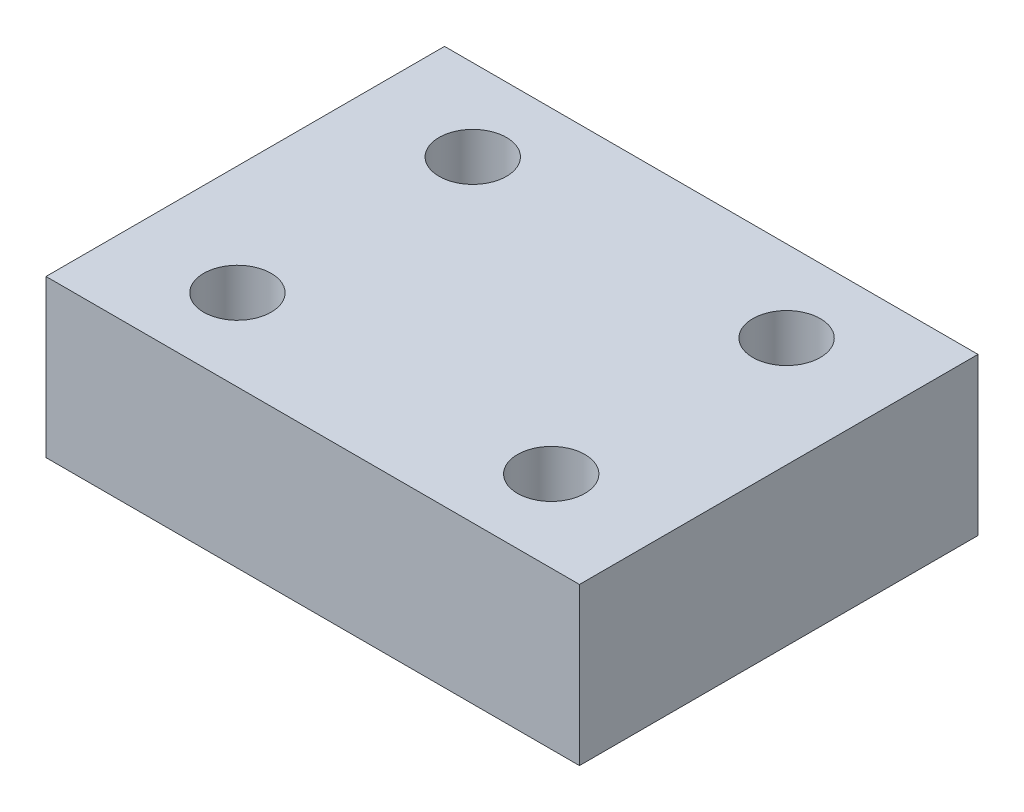
ISO-10303-21;
HEADER;
FILE_DESCRIPTION(('STEP AP214'),'2;1');
FILE_NAME('part.step','',(''),(''),'','','');
FILE_SCHEMA(('AUTOMOTIVE_DESIGN { 1 0 10303 214 1 1 1 1 }'));
ENDSEC;
DATA;
#1=APPLICATION_CONTEXT('core data for automotive mechanical design processes');
#2=APPLICATION_PROTOCOL_DEFINITION('international standard','automotive_design',2000,#1);
#3=PRODUCT_CONTEXT('',#1,'mechanical');
#4=PRODUCT('Part','Part','',(#3));
#5=PRODUCT_RELATED_PRODUCT_CATEGORY('part','',(#4));
#6=PRODUCT_DEFINITION_FORMATION('','',#4);
#7=PRODUCT_DEFINITION_CONTEXT('part definition',#1,'design');
#8=PRODUCT_DEFINITION('design','',#6,#7);
#9=PRODUCT_DEFINITION_SHAPE('','',#8);
#10=(LENGTH_UNIT() NAMED_UNIT(*) SI_UNIT(.MILLI.,.METRE.));
#11=(NAMED_UNIT(*) PLANE_ANGLE_UNIT() SI_UNIT($,.RADIAN.));
#12=(NAMED_UNIT(*) SI_UNIT($,.STERADIAN.) SOLID_ANGLE_UNIT());
#13=UNCERTAINTY_MEASURE_WITH_UNIT(LENGTH_MEASURE(1.E-05),#10,'distance_accuracy_value','');
#14=(GEOMETRIC_REPRESENTATION_CONTEXT(3) GLOBAL_UNCERTAINTY_ASSIGNED_CONTEXT((#13)) GLOBAL_UNIT_ASSIGNED_CONTEXT((#10,
#11,#12)) REPRESENTATION_CONTEXT('',''));
#15=CARTESIAN_POINT('',(0.,0.,0.));
#16=DIRECTION('',(0.,0.,1.));
#17=DIRECTION('',(1.,0.,0.));
#18=AXIS2_PLACEMENT_3D('',#15,#16,#17);
#19=CARTESIAN_POINT('',(-17.,-10.,-12.7));
#20=DIRECTION('',(-1.,0.,0.));
#21=DIRECTION('',(0.,0.,1.));
#22=AXIS2_PLACEMENT_3D('',#19,#20,#21);
#23=PLANE('',#22);
#24=DIRECTION('',(0.,0.,1.));
#25=VECTOR('',#24,1.);
#26=CARTESIAN_POINT('',(-17.,0.,-12.7));
#27=LINE('',#26,#25);
#28=CARTESIAN_POINT('',(-17.,0.,-12.7));
#29=VERTEX_POINT('',#28);
#30=CARTESIAN_POINT('',(-17.,0.,12.7));
#31=VERTEX_POINT('',#30);
#32=EDGE_CURVE('E101',#29,#31,#27,.T.);
#33=ORIENTED_EDGE('',*,*,#32,.F.);
#34=DIRECTION('',(0.,1.,0.));
#35=VECTOR('',#34,1.);
#36=CARTESIAN_POINT('',(-17.,-10.,-12.7));
#37=LINE('',#36,#35);
#38=CARTESIAN_POINT('',(-17.,-10.,-12.7));
#39=VERTEX_POINT('',#38);
#40=EDGE_CURVE('E11',#39,#29,#37,.T.);
#41=ORIENTED_EDGE('',*,*,#40,.F.);
#42=DIRECTION('',(0.,0.,1.));
#43=VECTOR('',#42,1.);
#44=CARTESIAN_POINT('',(-17.,-10.,-12.7));
#45=LINE('',#44,#43);
#46=CARTESIAN_POINT('',(-17.,-10.,12.7));
#47=VERTEX_POINT('',#46);
#48=EDGE_CURVE('E94',#39,#47,#45,.T.);
#49=ORIENTED_EDGE('',*,*,#48,.T.);
#50=DIRECTION('',(0.,1.,0.));
#51=VECTOR('',#50,1.);
#52=CARTESIAN_POINT('',(-17.,-10.,12.7));
#53=LINE('',#52,#51);
#54=EDGE_CURVE('E39',#47,#31,#53,.T.);
#55=ORIENTED_EDGE('',*,*,#54,.T.);
#56=EDGE_LOOP('',(#33,#41,#49,#55));
#57=FACE_BOUND('',#56,.T.);
#58=ADVANCED_FACE('F36',(#57),#23,.T.);
#59=CARTESIAN_POINT('',(-17.,-10.,-12.7));
#60=DIRECTION('',(0.,0.,-1.));
#61=DIRECTION('',(-1.,0.,0.));
#62=AXIS2_PLACEMENT_3D('',#59,#60,#61);
#63=PLANE('',#62);
#64=DIRECTION('',(-1.,0.,0.));
#65=VECTOR('',#64,1.);
#66=CARTESIAN_POINT('',(-17.,0.,-12.7));
#67=LINE('',#66,#65);
#68=CARTESIAN_POINT('',(17.,0.,-12.7));
#69=VERTEX_POINT('',#68);
#70=EDGE_CURVE('E96',#69,#29,#67,.T.);
#71=ORIENTED_EDGE('',*,*,#70,.F.);
#72=DIRECTION('',(0.,1.,0.));
#73=VECTOR('',#72,1.);
#74=CARTESIAN_POINT('',(17.,-10.,-12.7));
#75=LINE('',#74,#73);
#76=CARTESIAN_POINT('',(17.,-10.,-12.7));
#77=VERTEX_POINT('',#76);
#78=EDGE_CURVE('E45',#77,#69,#75,.T.);
#79=ORIENTED_EDGE('',*,*,#78,.F.);
#80=DIRECTION('',(-1.,0.,0.));
#81=VECTOR('',#80,1.);
#82=CARTESIAN_POINT('',(-17.,-10.,-12.7));
#83=LINE('',#82,#81);
#84=EDGE_CURVE('E91',#77,#39,#83,.T.);
#85=ORIENTED_EDGE('',*,*,#84,.T.);
#86=ORIENTED_EDGE('',*,*,#40,.T.);
#87=EDGE_LOOP('',(#71,#79,#85,#86));
#88=FACE_BOUND('',#87,.T.);
#89=ADVANCED_FACE('F112',(#88),#63,.T.);
#90=CARTESIAN_POINT('',(17.,-10.,-12.7));
#91=DIRECTION('',(1.,0.,0.));
#92=DIRECTION('',(0.,0.,-1.));
#93=AXIS2_PLACEMENT_3D('',#90,#91,#92);
#94=PLANE('',#93);
#95=DIRECTION('',(0.,0.,-1.));
#96=VECTOR('',#95,1.);
#97=CARTESIAN_POINT('',(17.,0.,-12.7));
#98=LINE('',#97,#96);
#99=CARTESIAN_POINT('',(17.,0.,12.7));
#100=VERTEX_POINT('',#99);
#101=EDGE_CURVE('E86',#100,#69,#98,.T.);
#102=ORIENTED_EDGE('',*,*,#101,.F.);
#103=DIRECTION('',(0.,1.,0.));
#104=VECTOR('',#103,1.);
#105=CARTESIAN_POINT('',(17.,-10.,12.7));
#106=LINE('',#105,#104);
#107=CARTESIAN_POINT('',(17.,-10.,12.7));
#108=VERTEX_POINT('',#107);
#109=EDGE_CURVE('E81',#108,#100,#106,.T.);
#110=ORIENTED_EDGE('',*,*,#109,.F.);
#111=DIRECTION('',(0.,0.,-1.));
#112=VECTOR('',#111,1.);
#113=CARTESIAN_POINT('',(17.,-10.,-12.7));
#114=LINE('',#113,#112);
#115=EDGE_CURVE('E84',#108,#77,#114,.T.);
#116=ORIENTED_EDGE('',*,*,#115,.T.);
#117=ORIENTED_EDGE('',*,*,#78,.T.);
#118=EDGE_LOOP('',(#102,#110,#116,#117));
#119=FACE_BOUND('',#118,.T.);
#120=ADVANCED_FACE('F83',(#119),#94,.T.);
#121=CARTESIAN_POINT('',(-17.,-10.,12.7));
#122=DIRECTION('',(0.,0.,1.));
#123=DIRECTION('',(1.,0.,0.));
#124=AXIS2_PLACEMENT_3D('',#121,#122,#123);
#125=PLANE('',#124);
#126=DIRECTION('',(1.,0.,0.));
#127=VECTOR('',#126,1.);
#128=CARTESIAN_POINT('',(-17.,0.,12.7));
#129=LINE('',#128,#127);
#130=EDGE_CURVE('E104',#31,#100,#129,.T.);
#131=ORIENTED_EDGE('',*,*,#130,.F.);
#132=ORIENTED_EDGE('',*,*,#54,.F.);
#133=DIRECTION('',(1.,0.,0.));
#134=VECTOR('',#133,1.);
#135=CARTESIAN_POINT('',(-17.,-10.,12.7));
#136=LINE('',#135,#134);
#137=EDGE_CURVE('E90',#47,#108,#136,.T.);
#138=ORIENTED_EDGE('',*,*,#137,.T.);
#139=ORIENTED_EDGE('',*,*,#109,.T.);
#140=EDGE_LOOP('',(#131,#132,#138,#139));
#141=FACE_BOUND('',#140,.T.);
#142=ADVANCED_FACE('F93',(#141),#125,.T.);
#143=CARTESIAN_POINT('',(0.,-10.,0.));
#144=DIRECTION('',(0.,1.,0.));
#145=DIRECTION('',(0.,0.,1.));
#146=AXIS2_PLACEMENT_3D('',#143,#144,#145);
#147=PLANE('',#146);
#148=CARTESIAN_POINT('',(-10.,-10.,-7.5));
#149=DIRECTION('',(0.,1.,0.));
#150=DIRECTION('',(0.,0.,1.));
#151=AXIS2_PLACEMENT_3D('',#148,#149,#150);
#152=CIRCLE('',#151,2.15);
#153=CARTESIAN_POINT('',(-10.,-10.,-5.35));
#154=VERTEX_POINT('',#153);
#155=EDGE_CURVE('E153',#154,#154,#152,.T.);
#156=ORIENTED_EDGE('',*,*,#155,.T.);
#157=EDGE_LOOP('',(#156));
#158=FACE_BOUND('',#157,.T.);
#159=CARTESIAN_POINT('',(-10.,-10.,7.5));
#160=DIRECTION('',(0.,1.,0.));
#161=DIRECTION('',(0.,0.,1.));
#162=AXIS2_PLACEMENT_3D('',#159,#160,#161);
#163=CIRCLE('',#162,2.15);
#164=CARTESIAN_POINT('',(-10.,-10.,9.65));
#165=VERTEX_POINT('',#164);
#166=EDGE_CURVE('E163',#165,#165,#163,.T.);
#167=ORIENTED_EDGE('',*,*,#166,.T.);
#168=EDGE_LOOP('',(#167));
#169=FACE_BOUND('',#168,.T.);
#170=CARTESIAN_POINT('',(10.,-10.,7.5));
#171=DIRECTION('',(0.,1.,0.));
#172=DIRECTION('',(0.,0.,1.));
#173=AXIS2_PLACEMENT_3D('',#170,#171,#172);
#174=CIRCLE('',#173,2.15);
#175=CARTESIAN_POINT('',(10.,-10.,9.65));
#176=VERTEX_POINT('',#175);
#177=EDGE_CURVE('E169',#176,#176,#174,.T.);
#178=ORIENTED_EDGE('',*,*,#177,.T.);
#179=EDGE_LOOP('',(#178));
#180=FACE_BOUND('',#179,.T.);
#181=CARTESIAN_POINT('',(10.,-10.,-7.5));
#182=DIRECTION('',(0.,1.,0.));
#183=DIRECTION('',(0.,0.,1.));
#184=AXIS2_PLACEMENT_3D('',#181,#182,#183);
#185=CIRCLE('',#184,2.15);
#186=CARTESIAN_POINT('',(10.,-10.,-5.35));
#187=VERTEX_POINT('',#186);
#188=EDGE_CURVE('E105',#187,#187,#185,.T.);
#189=ORIENTED_EDGE('',*,*,#188,.T.);
#190=EDGE_LOOP('',(#189));
#191=FACE_BOUND('',#190,.T.);
#192=ORIENTED_EDGE('',*,*,#48,.F.);
#193=ORIENTED_EDGE('',*,*,#84,.F.);
#194=ORIENTED_EDGE('',*,*,#115,.F.);
#195=ORIENTED_EDGE('',*,*,#137,.F.);
#196=EDGE_LOOP('',(#192,#193,#194,#195));
#197=FACE_BOUND('',#196,.T.);
#198=ADVANCED_FACE('F89',(#158,#169,#180,#191,#197),#147,.F.);
#199=CARTESIAN_POINT('',(0.,0.,0.));
#200=DIRECTION('',(0.,1.,0.));
#201=DIRECTION('',(0.,0.,1.));
#202=AXIS2_PLACEMENT_3D('',#199,#200,#201);
#203=PLANE('',#202);
#204=CARTESIAN_POINT('',(-10.,0.,-7.5));
#205=DIRECTION('',(0.,1.,0.));
#206=DIRECTION('',(0.,0.,1.));
#207=AXIS2_PLACEMENT_3D('',#204,#205,#206);
#208=CIRCLE('',#207,2.14999999999999);
#209=CARTESIAN_POINT('',(-10.,0.,-5.35000000000001));
#210=VERTEX_POINT('',#209);
#211=EDGE_CURVE('E156',#210,#210,#208,.T.);
#212=ORIENTED_EDGE('',*,*,#211,.F.);
#213=EDGE_LOOP('',(#212));
#214=FACE_BOUND('',#213,.T.);
#215=CARTESIAN_POINT('',(-10.,0.,7.5));
#216=DIRECTION('',(0.,1.,0.));
#217=DIRECTION('',(0.,0.,1.));
#218=AXIS2_PLACEMENT_3D('',#215,#216,#217);
#219=CIRCLE('',#218,2.14999999999999);
#220=CARTESIAN_POINT('',(-10.,0.,9.64999999999999));
#221=VERTEX_POINT('',#220);
#222=EDGE_CURVE('E158',#221,#221,#219,.T.);
#223=ORIENTED_EDGE('',*,*,#222,.F.);
#224=EDGE_LOOP('',(#223));
#225=FACE_BOUND('',#224,.T.);
#226=CARTESIAN_POINT('',(10.,0.,7.5));
#227=DIRECTION('',(0.,1.,0.));
#228=DIRECTION('',(0.,0.,1.));
#229=AXIS2_PLACEMENT_3D('',#226,#227,#228);
#230=CIRCLE('',#229,2.14999999999999);
#231=CARTESIAN_POINT('',(10.,0.,9.64999999999999));
#232=VERTEX_POINT('',#231);
#233=EDGE_CURVE('E166',#232,#232,#230,.T.);
#234=ORIENTED_EDGE('',*,*,#233,.F.);
#235=EDGE_LOOP('',(#234));
#236=FACE_BOUND('',#235,.T.);
#237=CARTESIAN_POINT('',(10.,0.,-7.5));
#238=DIRECTION('',(0.,1.,0.));
#239=DIRECTION('',(0.,0.,1.));
#240=AXIS2_PLACEMENT_3D('',#237,#238,#239);
#241=CIRCLE('',#240,2.14999999999999);
#242=CARTESIAN_POINT('',(10.,0.,-5.35000000000001));
#243=VERTEX_POINT('',#242);
#244=EDGE_CURVE('E172',#243,#243,#241,.T.);
#245=ORIENTED_EDGE('',*,*,#244,.F.);
#246=EDGE_LOOP('',(#245));
#247=FACE_BOUND('',#246,.T.);
#248=ORIENTED_EDGE('',*,*,#32,.T.);
#249=ORIENTED_EDGE('',*,*,#130,.T.);
#250=ORIENTED_EDGE('',*,*,#101,.T.);
#251=ORIENTED_EDGE('',*,*,#70,.T.);
#252=EDGE_LOOP('',(#248,#249,#250,#251));
#253=FACE_BOUND('',#252,.T.);
#254=ADVANCED_FACE('F111',(#214,#225,#236,#247,#253),#203,.T.);
#255=CARTESIAN_POINT('',(10.,0.,-7.5));
#256=DIRECTION('',(0.,1.,0.));
#257=DIRECTION('',(0.,0.,1.));
#258=AXIS2_PLACEMENT_3D('',#255,#256,#257);
#259=CYLINDRICAL_SURFACE('',#258,2.14999999999999);
#260=ORIENTED_EDGE('',*,*,#188,.F.);
#261=EDGE_LOOP('',(#260));
#262=FACE_BOUND('',#261,.T.);
#263=ORIENTED_EDGE('',*,*,#244,.T.);
#264=EDGE_LOOP('',(#263));
#265=FACE_BOUND('',#264,.T.);
#266=ADVANCED_FACE('F130',(#262,#265),#259,.F.);
#267=CARTESIAN_POINT('',(10.,0.,7.5));
#268=DIRECTION('',(0.,1.,0.));
#269=DIRECTION('',(0.,0.,1.));
#270=AXIS2_PLACEMENT_3D('',#267,#268,#269);
#271=CYLINDRICAL_SURFACE('',#270,2.14999999999999);
#272=ORIENTED_EDGE('',*,*,#177,.F.);
#273=EDGE_LOOP('',(#272));
#274=FACE_BOUND('',#273,.T.);
#275=ORIENTED_EDGE('',*,*,#233,.T.);
#276=EDGE_LOOP('',(#275));
#277=FACE_BOUND('',#276,.T.);
#278=ADVANCED_FACE('F137',(#274,#277),#271,.F.);
#279=CARTESIAN_POINT('',(-10.,0.,7.5));
#280=DIRECTION('',(0.,1.,0.));
#281=DIRECTION('',(0.,0.,1.));
#282=AXIS2_PLACEMENT_3D('',#279,#280,#281);
#283=CYLINDRICAL_SURFACE('',#282,2.14999999999999);
#284=ORIENTED_EDGE('',*,*,#166,.F.);
#285=EDGE_LOOP('',(#284));
#286=FACE_BOUND('',#285,.T.);
#287=ORIENTED_EDGE('',*,*,#222,.T.);
#288=EDGE_LOOP('',(#287));
#289=FACE_BOUND('',#288,.T.);
#290=ADVANCED_FACE('F141',(#286,#289),#283,.F.);
#291=CARTESIAN_POINT('',(-10.,0.,-7.5));
#292=DIRECTION('',(0.,1.,0.));
#293=DIRECTION('',(0.,0.,1.));
#294=AXIS2_PLACEMENT_3D('',#291,#292,#293);
#295=CYLINDRICAL_SURFACE('',#294,2.14999999999999);
#296=ORIENTED_EDGE('',*,*,#155,.F.);
#297=EDGE_LOOP('',(#296));
#298=FACE_BOUND('',#297,.T.);
#299=ORIENTED_EDGE('',*,*,#211,.T.);
#300=EDGE_LOOP('',(#299));
#301=FACE_BOUND('',#300,.T.);
#302=ADVANCED_FACE('F145',(#298,#301),#295,.F.);
#303=CLOSED_SHELL('',(#58,#89,#120,#142,#198,#254,#266,#278,#290,#302));
#304=MANIFOLD_SOLID_BREP('B2',#303);
#305=ADVANCED_BREP_SHAPE_REPRESENTATION('',(#18,#304),#14);
#306=SHAPE_DEFINITION_REPRESENTATION(#9,#305);
ENDSEC;
END-ISO-10303-21;
